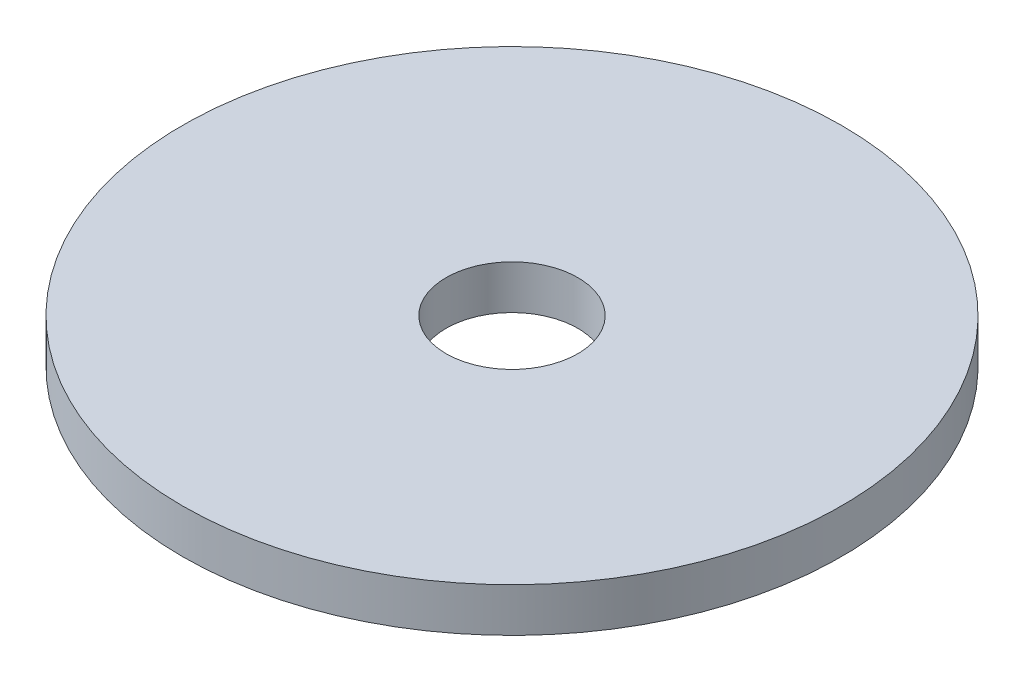
ISO-10303-21;
HEADER;
FILE_DESCRIPTION(('STEP AP214'),'2;1');
FILE_NAME('part.step','',(''),(''),'','','');
FILE_SCHEMA(('AUTOMOTIVE_DESIGN { 1 0 10303 214 1 1 1 1 }'));
ENDSEC;
DATA;
#1=APPLICATION_CONTEXT('core data for automotive mechanical design processes');
#2=APPLICATION_PROTOCOL_DEFINITION('international standard','automotive_design',2000,#1);
#3=PRODUCT_CONTEXT('',#1,'mechanical');
#4=PRODUCT('Part','Part','',(#3));
#5=PRODUCT_RELATED_PRODUCT_CATEGORY('part','',(#4));
#6=PRODUCT_DEFINITION_FORMATION('','',#4);
#7=PRODUCT_DEFINITION_CONTEXT('part definition',#1,'design');
#8=PRODUCT_DEFINITION('design','',#6,#7);
#9=PRODUCT_DEFINITION_SHAPE('','',#8);
#10=(LENGTH_UNIT() NAMED_UNIT(*) SI_UNIT(.MILLI.,.METRE.));
#11=(NAMED_UNIT(*) PLANE_ANGLE_UNIT() SI_UNIT($,.RADIAN.));
#12=(NAMED_UNIT(*) SI_UNIT($,.STERADIAN.) SOLID_ANGLE_UNIT());
#13=UNCERTAINTY_MEASURE_WITH_UNIT(LENGTH_MEASURE(1.E-05),#10,'distance_accuracy_value','');
#14=(GEOMETRIC_REPRESENTATION_CONTEXT(3) GLOBAL_UNCERTAINTY_ASSIGNED_CONTEXT((#13)) GLOBAL_UNIT_ASSIGNED_CONTEXT((#10,
#11,#12)) REPRESENTATION_CONTEXT('',''));
#15=CARTESIAN_POINT('',(0.,0.,0.));
#16=DIRECTION('',(0.,0.,1.));
#17=DIRECTION('',(1.,0.,0.));
#18=AXIS2_PLACEMENT_3D('',#15,#16,#17);
#19=CARTESIAN_POINT('',(0.,1.,0.));
#20=DIRECTION('',(0.,1.,0.));
#21=DIRECTION('',(0.,0.,1.));
#22=AXIS2_PLACEMENT_3D('',#19,#20,#21);
#23=PLANE('',#22);
#24=CARTESIAN_POINT('',(0.,1.,0.));
#25=DIRECTION('',(0.,1.,0.));
#26=DIRECTION('',(0.,0.,1.));
#27=AXIS2_PLACEMENT_3D('',#24,#25,#26);
#28=CIRCLE('',#27,7.5);
#29=CARTESIAN_POINT('',(0.,1.,7.5));
#30=VERTEX_POINT('',#29);
#31=EDGE_CURVE('E10',#30,#30,#28,.T.);
#32=ORIENTED_EDGE('',*,*,#31,.T.);
#33=EDGE_LOOP('',(#32));
#34=FACE_BOUND('',#33,.T.);
#35=CARTESIAN_POINT('',(0.,1.,0.));
#36=DIRECTION('',(0.,1.,0.));
#37=DIRECTION('',(0.,0.,1.));
#38=AXIS2_PLACEMENT_3D('',#35,#36,#37);
#39=CIRCLE('',#38,1.5);
#40=CARTESIAN_POINT('',(0.,1.,1.5));
#41=VERTEX_POINT('',#40);
#42=EDGE_CURVE('E42',#41,#41,#39,.T.);
#43=ORIENTED_EDGE('',*,*,#42,.F.);
#44=EDGE_LOOP('',(#43));
#45=FACE_BOUND('',#44,.T.);
#46=ADVANCED_FACE('F31',(#34,#45),#23,.T.);
#47=CARTESIAN_POINT('',(0.,0.,0.));
#48=DIRECTION('',(0.,1.,0.));
#49=DIRECTION('',(0.,0.,1.));
#50=AXIS2_PLACEMENT_3D('',#47,#48,#49);
#51=PLANE('',#50);
#52=CARTESIAN_POINT('',(0.,0.,0.));
#53=DIRECTION('',(0.,1.,0.));
#54=DIRECTION('',(0.,0.,1.));
#55=AXIS2_PLACEMENT_3D('',#52,#53,#54);
#56=CIRCLE('',#55,7.5);
#57=CARTESIAN_POINT('',(0.,0.,7.5));
#58=VERTEX_POINT('',#57);
#59=EDGE_CURVE('E35',#58,#58,#56,.T.);
#60=ORIENTED_EDGE('',*,*,#59,.F.);
#61=EDGE_LOOP('',(#60));
#62=FACE_BOUND('',#61,.T.);
#63=CARTESIAN_POINT('',(0.,0.,0.));
#64=DIRECTION('',(0.,1.,0.));
#65=DIRECTION('',(0.,0.,1.));
#66=AXIS2_PLACEMENT_3D('',#63,#64,#65);
#67=CIRCLE('',#66,1.5);
#68=CARTESIAN_POINT('',(0.,0.,1.5));
#69=VERTEX_POINT('',#68);
#70=EDGE_CURVE('E44',#69,#69,#67,.T.);
#71=ORIENTED_EDGE('',*,*,#70,.T.);
#72=EDGE_LOOP('',(#71));
#73=FACE_BOUND('',#72,.T.);
#74=ADVANCED_FACE('F54',(#62,#73),#51,.F.);
#75=CARTESIAN_POINT('',(0.,1.,0.));
#76=DIRECTION('',(0.,-1.,0.));
#77=DIRECTION('',(0.,0.,-1.));
#78=AXIS2_PLACEMENT_3D('',#75,#76,#77);
#79=CYLINDRICAL_SURFACE('',#78,7.5);
#80=ORIENTED_EDGE('',*,*,#31,.F.);
#81=EDGE_LOOP('',(#80));
#82=FACE_BOUND('',#81,.T.);
#83=ORIENTED_EDGE('',*,*,#59,.T.);
#84=EDGE_LOOP('',(#83));
#85=FACE_BOUND('',#84,.T.);
#86=ADVANCED_FACE('F33',(#82,#85),#79,.T.);
#87=CARTESIAN_POINT('',(0.,1.,0.));
#88=DIRECTION('',(0.,-1.,0.));
#89=DIRECTION('',(0.,0.,-1.));
#90=AXIS2_PLACEMENT_3D('',#87,#88,#89);
#91=CYLINDRICAL_SURFACE('',#90,1.5);
#92=ORIENTED_EDGE('',*,*,#42,.T.);
#93=EDGE_LOOP('',(#92));
#94=FACE_BOUND('',#93,.T.);
#95=ORIENTED_EDGE('',*,*,#70,.F.);
#96=EDGE_LOOP('',(#95));
#97=FACE_BOUND('',#96,.T.);
#98=ADVANCED_FACE('F50',(#94,#97),#91,.F.);
#99=CLOSED_SHELL('',(#46,#74,#86,#98));
#100=MANIFOLD_SOLID_BREP('B2',#99);
#101=ADVANCED_BREP_SHAPE_REPRESENTATION('',(#18,#100),#14);
#102=SHAPE_DEFINITION_REPRESENTATION(#9,#101);
ENDSEC;
END-ISO-10303-21;
